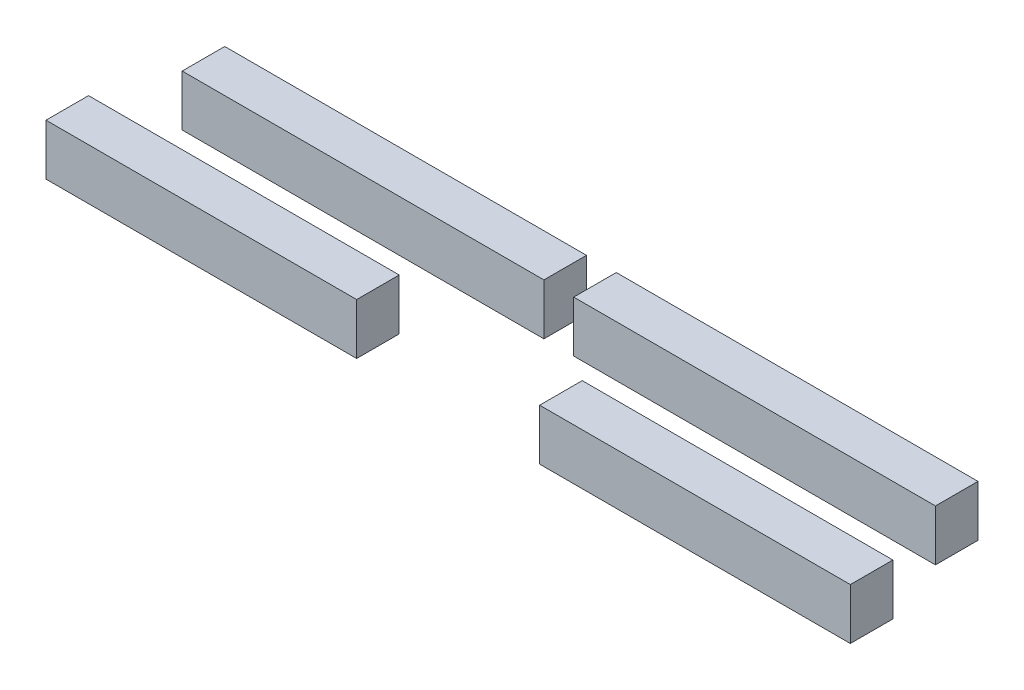
ISO-10303-21;
HEADER;
FILE_DESCRIPTION(('STEP AP214'),'2;1');
FILE_NAME('part.step','',(''),(''),'','','');
FILE_SCHEMA(('AUTOMOTIVE_DESIGN { 1 0 10303 214 1 1 1 1 }'));
ENDSEC;
DATA;
#1=APPLICATION_CONTEXT('core data for automotive mechanical design processes');
#2=APPLICATION_PROTOCOL_DEFINITION('international standard','automotive_design',2000,#1);
#3=PRODUCT_CONTEXT('',#1,'mechanical');
#4=PRODUCT('Part','Part','',(#3));
#5=PRODUCT_RELATED_PRODUCT_CATEGORY('part','',(#4));
#6=PRODUCT_DEFINITION_FORMATION('','',#4);
#7=PRODUCT_DEFINITION_CONTEXT('part definition',#1,'design');
#8=PRODUCT_DEFINITION('design','',#6,#7);
#9=PRODUCT_DEFINITION_SHAPE('','',#8);
#10=(LENGTH_UNIT() NAMED_UNIT(*) SI_UNIT(.MILLI.,.METRE.));
#11=(NAMED_UNIT(*) PLANE_ANGLE_UNIT() SI_UNIT($,.RADIAN.));
#12=(NAMED_UNIT(*) SI_UNIT($,.STERADIAN.) SOLID_ANGLE_UNIT());
#13=UNCERTAINTY_MEASURE_WITH_UNIT(LENGTH_MEASURE(1.E-05),#10,'distance_accuracy_value','');
#14=(GEOMETRIC_REPRESENTATION_CONTEXT(3) GLOBAL_UNCERTAINTY_ASSIGNED_CONTEXT((#13)) GLOBAL_UNIT_ASSIGNED_CONTEXT((#10,
#11,#12)) REPRESENTATION_CONTEXT('',''));
#15=CARTESIAN_POINT('',(0.,0.,0.));
#16=DIRECTION('',(0.,0.,1.));
#17=DIRECTION('',(1.,0.,0.));
#18=AXIS2_PLACEMENT_3D('',#15,#16,#17);
#19=CARTESIAN_POINT('',(51.75,6.,-22.5));
#20=DIRECTION('',(1.,0.,0.));
#21=DIRECTION('',(0.,0.,-1.));
#22=AXIS2_PLACEMENT_3D('',#19,#20,#21);
#23=PLANE('',#22);
#24=DIRECTION('',(0.,0.,1.));
#25=VECTOR('',#24,1.);
#26=CARTESIAN_POINT('',(51.75,0.,-22.5));
#27=LINE('',#26,#25);
#28=CARTESIAN_POINT('',(51.75,0.,-22.5));
#29=VERTEX_POINT('',#28);
#30=CARTESIAN_POINT('',(51.75,0.,-17.5));
#31=VERTEX_POINT('',#30);
#32=EDGE_CURVE('E106',#29,#31,#27,.T.);
#33=ORIENTED_EDGE('',*,*,#32,.T.);
#34=DIRECTION('',(0.,-1.,0.));
#35=VECTOR('',#34,1.);
#36=CARTESIAN_POINT('',(51.75,6.,-17.5));
#37=LINE('',#36,#35);
#38=CARTESIAN_POINT('',(51.75,6.,-17.5));
#39=VERTEX_POINT('',#38);
#40=EDGE_CURVE('E12',#39,#31,#37,.T.);
#41=ORIENTED_EDGE('',*,*,#40,.F.);
#42=DIRECTION('',(0.,0.,1.));
#43=VECTOR('',#42,1.);
#44=CARTESIAN_POINT('',(51.75,6.,-22.5));
#45=LINE('',#44,#43);
#46=CARTESIAN_POINT('',(51.75,6.,-22.5));
#47=VERTEX_POINT('',#46);
#48=EDGE_CURVE('E94',#47,#39,#45,.T.);
#49=ORIENTED_EDGE('',*,*,#48,.F.);
#50=DIRECTION('',(0.,-1.,0.));
#51=VECTOR('',#50,1.);
#52=CARTESIAN_POINT('',(51.75,6.,-22.5));
#53=LINE('',#52,#51);
#54=EDGE_CURVE('E102',#47,#29,#53,.T.);
#55=ORIENTED_EDGE('',*,*,#54,.T.);
#56=EDGE_LOOP('',(#33,#41,#49,#55));
#57=FACE_BOUND('',#56,.T.);
#58=ADVANCED_FACE('F43',(#57),#23,.F.);
#59=CARTESIAN_POINT('',(51.75,6.,-17.5));
#60=DIRECTION('',(0.,0.,-1.));
#61=DIRECTION('',(-1.,0.,0.));
#62=AXIS2_PLACEMENT_3D('',#59,#60,#61);
#63=PLANE('',#62);
#64=DIRECTION('',(1.,0.,0.));
#65=VECTOR('',#64,1.);
#66=CARTESIAN_POINT('',(51.75,0.,-17.5));
#67=LINE('',#66,#65);
#68=CARTESIAN_POINT('',(94.25,0.,-17.5));
#69=VERTEX_POINT('',#68);
#70=EDGE_CURVE('E98',#31,#69,#67,.T.);
#71=ORIENTED_EDGE('',*,*,#70,.T.);
#72=DIRECTION('',(0.,-1.,0.));
#73=VECTOR('',#72,1.);
#74=CARTESIAN_POINT('',(94.25,6.,-17.5));
#75=LINE('',#74,#73);
#76=CARTESIAN_POINT('',(94.25,6.,-17.5));
#77=VERTEX_POINT('',#76);
#78=EDGE_CURVE('E51',#77,#69,#75,.T.);
#79=ORIENTED_EDGE('',*,*,#78,.F.);
#80=DIRECTION('',(1.,0.,0.));
#81=VECTOR('',#80,1.);
#82=CARTESIAN_POINT('',(51.75,6.,-17.5));
#83=LINE('',#82,#81);
#84=EDGE_CURVE('E89',#39,#77,#83,.T.);
#85=ORIENTED_EDGE('',*,*,#84,.F.);
#86=ORIENTED_EDGE('',*,*,#40,.T.);
#87=EDGE_LOOP('',(#71,#79,#85,#86));
#88=FACE_BOUND('',#87,.T.);
#89=ADVANCED_FACE('F97',(#88),#63,.F.);
#90=CARTESIAN_POINT('',(94.25,6.,-22.5));
#91=DIRECTION('',(-1.,0.,0.));
#92=DIRECTION('',(0.,0.,1.));
#93=AXIS2_PLACEMENT_3D('',#90,#91,#92);
#94=PLANE('',#93);
#95=DIRECTION('',(0.,0.,-1.));
#96=VECTOR('',#95,1.);
#97=CARTESIAN_POINT('',(94.25,0.,-22.5));
#98=LINE('',#97,#96);
#99=CARTESIAN_POINT('',(94.25,0.,-22.5));
#100=VERTEX_POINT('',#99);
#101=EDGE_CURVE('E76',#69,#100,#98,.T.);
#102=ORIENTED_EDGE('',*,*,#101,.T.);
#103=DIRECTION('',(0.,-1.,0.));
#104=VECTOR('',#103,1.);
#105=CARTESIAN_POINT('',(94.25,6.,-22.5));
#106=LINE('',#105,#104);
#107=CARTESIAN_POINT('',(94.25,6.,-22.5));
#108=VERTEX_POINT('',#107);
#109=EDGE_CURVE('E99',#108,#100,#106,.T.);
#110=ORIENTED_EDGE('',*,*,#109,.F.);
#111=DIRECTION('',(0.,0.,-1.));
#112=VECTOR('',#111,1.);
#113=CARTESIAN_POINT('',(94.25,6.,-22.5));
#114=LINE('',#113,#112);
#115=EDGE_CURVE('E92',#77,#108,#114,.T.);
#116=ORIENTED_EDGE('',*,*,#115,.F.);
#117=ORIENTED_EDGE('',*,*,#78,.T.);
#118=EDGE_LOOP('',(#102,#110,#116,#117));
#119=FACE_BOUND('',#118,.T.);
#120=ADVANCED_FACE('F100',(#119),#94,.F.);
#121=CARTESIAN_POINT('',(51.75,6.,-22.5));
#122=DIRECTION('',(0.,0.,1.));
#123=DIRECTION('',(1.,0.,0.));
#124=AXIS2_PLACEMENT_3D('',#121,#122,#123);
#125=PLANE('',#124);
#126=DIRECTION('',(-1.,0.,0.));
#127=VECTOR('',#126,1.);
#128=CARTESIAN_POINT('',(51.75,0.,-22.5));
#129=LINE('',#128,#127);
#130=EDGE_CURVE('E82',#100,#29,#129,.T.);
#131=ORIENTED_EDGE('',*,*,#130,.T.);
#132=ORIENTED_EDGE('',*,*,#54,.F.);
#133=DIRECTION('',(-1.,0.,0.));
#134=VECTOR('',#133,1.);
#135=CARTESIAN_POINT('',(51.75,6.,-22.5));
#136=LINE('',#135,#134);
#137=EDGE_CURVE('E59',#108,#47,#136,.T.);
#138=ORIENTED_EDGE('',*,*,#137,.F.);
#139=ORIENTED_EDGE('',*,*,#109,.T.);
#140=EDGE_LOOP('',(#131,#132,#138,#139));
#141=FACE_BOUND('',#140,.T.);
#142=ADVANCED_FACE('F113',(#141),#125,.F.);
#143=CARTESIAN_POINT('',(51.75,6.,-17.5));
#144=DIRECTION('',(0.,1.,0.));
#145=DIRECTION('',(0.,0.,1.));
#146=AXIS2_PLACEMENT_3D('',#143,#144,#145);
#147=PLANE('',#146);
#148=ORIENTED_EDGE('',*,*,#48,.T.);
#149=ORIENTED_EDGE('',*,*,#84,.T.);
#150=ORIENTED_EDGE('',*,*,#115,.T.);
#151=ORIENTED_EDGE('',*,*,#137,.T.);
#152=EDGE_LOOP('',(#148,#149,#150,#151));
#153=FACE_BOUND('',#152,.T.);
#154=ADVANCED_FACE('F90',(#153),#147,.T.);
#155=CARTESIAN_POINT('',(51.75,0.,-17.5));
#156=DIRECTION('',(0.,1.,0.));
#157=DIRECTION('',(0.,0.,1.));
#158=AXIS2_PLACEMENT_3D('',#155,#156,#157);
#159=PLANE('',#158);
#160=ORIENTED_EDGE('',*,*,#32,.F.);
#161=ORIENTED_EDGE('',*,*,#130,.F.);
#162=ORIENTED_EDGE('',*,*,#101,.F.);
#163=ORIENTED_EDGE('',*,*,#70,.F.);
#164=EDGE_LOOP('',(#160,#161,#162,#163));
#165=FACE_BOUND('',#164,.T.);
#166=ADVANCED_FACE('F116',(#165),#159,.F.);
#167=CLOSED_SHELL('',(#58,#89,#120,#142,#154,#166));
#168=MANIFOLD_SOLID_BREP('B2',#167);
#169=CARTESIAN_POINT('',(5.75,6.,-22.5));
#170=DIRECTION('',(1.,0.,0.));
#171=DIRECTION('',(0.,0.,-1.));
#172=AXIS2_PLACEMENT_3D('',#169,#170,#171);
#173=PLANE('',#172);
#174=DIRECTION('',(0.,0.,1.));
#175=VECTOR('',#174,1.);
#176=CARTESIAN_POINT('',(5.75,0.,-22.5));
#177=LINE('',#176,#175);
#178=CARTESIAN_POINT('',(5.75,0.,-22.5));
#179=VERTEX_POINT('',#178);
#180=CARTESIAN_POINT('',(5.75,0.,-17.5));
#181=VERTEX_POINT('',#180);
#182=EDGE_CURVE('E239',#179,#181,#177,.T.);
#183=ORIENTED_EDGE('',*,*,#182,.T.);
#184=DIRECTION('',(0.,-1.,0.));
#185=VECTOR('',#184,1.);
#186=CARTESIAN_POINT('',(5.75,6.,-17.5));
#187=LINE('',#186,#185);
#188=CARTESIAN_POINT('',(5.75,6.,-17.5));
#189=VERTEX_POINT('',#188);
#190=EDGE_CURVE('E41',#189,#181,#187,.T.);
#191=ORIENTED_EDGE('',*,*,#190,.F.);
#192=DIRECTION('',(0.,0.,1.));
#193=VECTOR('',#192,1.);
#194=CARTESIAN_POINT('',(5.75,6.,-22.5));
#195=LINE('',#194,#193);
#196=CARTESIAN_POINT('',(5.75,6.,-22.5));
#197=VERTEX_POINT('',#196);
#198=EDGE_CURVE('E227',#197,#189,#195,.T.);
#199=ORIENTED_EDGE('',*,*,#198,.F.);
#200=DIRECTION('',(0.,-1.,0.));
#201=VECTOR('',#200,1.);
#202=CARTESIAN_POINT('',(5.75,6.,-22.5));
#203=LINE('',#202,#201);
#204=EDGE_CURVE('E235',#197,#179,#203,.T.);
#205=ORIENTED_EDGE('',*,*,#204,.T.);
#206=EDGE_LOOP('',(#183,#191,#199,#205));
#207=FACE_BOUND('',#206,.T.);
#208=ADVANCED_FACE('F176',(#207),#173,.F.);
#209=CARTESIAN_POINT('',(5.75,6.,-17.5));
#210=DIRECTION('',(0.,0.,-1.));
#211=DIRECTION('',(-1.,0.,0.));
#212=AXIS2_PLACEMENT_3D('',#209,#210,#211);
#213=PLANE('',#212);
#214=DIRECTION('',(1.,0.,0.));
#215=VECTOR('',#214,1.);
#216=CARTESIAN_POINT('',(5.75,0.,-17.5));
#217=LINE('',#216,#215);
#218=CARTESIAN_POINT('',(48.25,0.,-17.5));
#219=VERTEX_POINT('',#218);
#220=EDGE_CURVE('E231',#181,#219,#217,.T.);
#221=ORIENTED_EDGE('',*,*,#220,.T.);
#222=DIRECTION('',(0.,-1.,0.));
#223=VECTOR('',#222,1.);
#224=CARTESIAN_POINT('',(48.25,6.,-17.5));
#225=LINE('',#224,#223);
#226=CARTESIAN_POINT('',(48.25,6.,-17.5));
#227=VERTEX_POINT('',#226);
#228=EDGE_CURVE('E184',#227,#219,#225,.T.);
#229=ORIENTED_EDGE('',*,*,#228,.F.);
#230=DIRECTION('',(1.,0.,0.));
#231=VECTOR('',#230,1.);
#232=CARTESIAN_POINT('',(5.75,6.,-17.5));
#233=LINE('',#232,#231);
#234=EDGE_CURVE('E222',#189,#227,#233,.T.);
#235=ORIENTED_EDGE('',*,*,#234,.F.);
#236=ORIENTED_EDGE('',*,*,#190,.T.);
#237=EDGE_LOOP('',(#221,#229,#235,#236));
#238=FACE_BOUND('',#237,.T.);
#239=ADVANCED_FACE('F230',(#238),#213,.F.);
#240=CARTESIAN_POINT('',(48.25,6.,-22.5));
#241=DIRECTION('',(-1.,0.,0.));
#242=DIRECTION('',(0.,0.,1.));
#243=AXIS2_PLACEMENT_3D('',#240,#241,#242);
#244=PLANE('',#243);
#245=DIRECTION('',(0.,0.,-1.));
#246=VECTOR('',#245,1.);
#247=CARTESIAN_POINT('',(48.25,0.,-22.5));
#248=LINE('',#247,#246);
#249=CARTESIAN_POINT('',(48.25,0.,-22.5));
#250=VERTEX_POINT('',#249);
#251=EDGE_CURVE('E209',#219,#250,#248,.T.);
#252=ORIENTED_EDGE('',*,*,#251,.T.);
#253=DIRECTION('',(0.,-1.,0.));
#254=VECTOR('',#253,1.);
#255=CARTESIAN_POINT('',(48.25,6.,-22.5));
#256=LINE('',#255,#254);
#257=CARTESIAN_POINT('',(48.25,6.,-22.5));
#258=VERTEX_POINT('',#257);
#259=EDGE_CURVE('E232',#258,#250,#256,.T.);
#260=ORIENTED_EDGE('',*,*,#259,.F.);
#261=DIRECTION('',(0.,0.,-1.));
#262=VECTOR('',#261,1.);
#263=CARTESIAN_POINT('',(48.25,6.,-22.5));
#264=LINE('',#263,#262);
#265=EDGE_CURVE('E225',#227,#258,#264,.T.);
#266=ORIENTED_EDGE('',*,*,#265,.F.);
#267=ORIENTED_EDGE('',*,*,#228,.T.);
#268=EDGE_LOOP('',(#252,#260,#266,#267));
#269=FACE_BOUND('',#268,.T.);
#270=ADVANCED_FACE('F233',(#269),#244,.F.);
#271=CARTESIAN_POINT('',(5.75,6.,-22.5));
#272=DIRECTION('',(0.,0.,1.));
#273=DIRECTION('',(1.,0.,0.));
#274=AXIS2_PLACEMENT_3D('',#271,#272,#273);
#275=PLANE('',#274);
#276=DIRECTION('',(-1.,0.,0.));
#277=VECTOR('',#276,1.);
#278=CARTESIAN_POINT('',(5.75,0.,-22.5));
#279=LINE('',#278,#277);
#280=EDGE_CURVE('E215',#250,#179,#279,.T.);
#281=ORIENTED_EDGE('',*,*,#280,.T.);
#282=ORIENTED_EDGE('',*,*,#204,.F.);
#283=DIRECTION('',(-1.,0.,0.));
#284=VECTOR('',#283,1.);
#285=CARTESIAN_POINT('',(5.75,6.,-22.5));
#286=LINE('',#285,#284);
#287=EDGE_CURVE('E192',#258,#197,#286,.T.);
#288=ORIENTED_EDGE('',*,*,#287,.F.);
#289=ORIENTED_EDGE('',*,*,#259,.T.);
#290=EDGE_LOOP('',(#281,#282,#288,#289));
#291=FACE_BOUND('',#290,.T.);
#292=ADVANCED_FACE('F246',(#291),#275,.F.);
#293=CARTESIAN_POINT('',(5.75,6.,-17.5));
#294=DIRECTION('',(0.,1.,0.));
#295=DIRECTION('',(0.,0.,1.));
#296=AXIS2_PLACEMENT_3D('',#293,#294,#295);
#297=PLANE('',#296);
#298=ORIENTED_EDGE('',*,*,#198,.T.);
#299=ORIENTED_EDGE('',*,*,#234,.T.);
#300=ORIENTED_EDGE('',*,*,#265,.T.);
#301=ORIENTED_EDGE('',*,*,#287,.T.);
#302=EDGE_LOOP('',(#298,#299,#300,#301));
#303=FACE_BOUND('',#302,.T.);
#304=ADVANCED_FACE('F223',(#303),#297,.T.);
#305=CARTESIAN_POINT('',(5.75,0.,-17.5));
#306=DIRECTION('',(0.,1.,0.));
#307=DIRECTION('',(0.,0.,1.));
#308=AXIS2_PLACEMENT_3D('',#305,#306,#307);
#309=PLANE('',#308);
#310=ORIENTED_EDGE('',*,*,#182,.F.);
#311=ORIENTED_EDGE('',*,*,#280,.F.);
#312=ORIENTED_EDGE('',*,*,#251,.F.);
#313=ORIENTED_EDGE('',*,*,#220,.F.);
#314=EDGE_LOOP('',(#310,#311,#312,#313));
#315=FACE_BOUND('',#314,.T.);
#316=ADVANCED_FACE('F249',(#315),#309,.F.);
#317=CLOSED_SHELL('',(#208,#239,#270,#292,#304,#316));
#318=MANIFOLD_SOLID_BREP('B6',#317);
#319=CARTESIAN_POINT('',(60.75,6.,-9.5));
#320=DIRECTION('',(1.,0.,0.));
#321=DIRECTION('',(0.,0.,-1.));
#322=AXIS2_PLACEMENT_3D('',#319,#320,#321);
#323=PLANE('',#322);
#324=DIRECTION('',(0.,0.,1.));
#325=VECTOR('',#324,1.);
#326=CARTESIAN_POINT('',(60.75,0.,-9.5));
#327=LINE('',#326,#325);
#328=CARTESIAN_POINT('',(60.75,0.,-9.5));
#329=VERTEX_POINT('',#328);
#330=CARTESIAN_POINT('',(60.75,0.,-4.5));
#331=VERTEX_POINT('',#330);
#332=EDGE_CURVE('E371',#329,#331,#327,.T.);
#333=ORIENTED_EDGE('',*,*,#332,.T.);
#334=DIRECTION('',(0.,-1.,0.));
#335=VECTOR('',#334,1.);
#336=CARTESIAN_POINT('',(60.75,6.,-4.5));
#337=LINE('',#336,#335);
#338=CARTESIAN_POINT('',(60.75,6.,-4.5));
#339=VERTEX_POINT('',#338);
#340=EDGE_CURVE('E174',#339,#331,#337,.T.);
#341=ORIENTED_EDGE('',*,*,#340,.F.);
#342=DIRECTION('',(0.,0.,1.));
#343=VECTOR('',#342,1.);
#344=CARTESIAN_POINT('',(60.75,6.,-9.5));
#345=LINE('',#344,#343);
#346=CARTESIAN_POINT('',(60.75,6.,-9.5));
#347=VERTEX_POINT('',#346);
#348=EDGE_CURVE('E359',#347,#339,#345,.T.);
#349=ORIENTED_EDGE('',*,*,#348,.F.);
#350=DIRECTION('',(0.,-1.,0.));
#351=VECTOR('',#350,1.);
#352=CARTESIAN_POINT('',(60.75,6.,-9.5));
#353=LINE('',#352,#351);
#354=EDGE_CURVE('E367',#347,#329,#353,.T.);
#355=ORIENTED_EDGE('',*,*,#354,.T.);
#356=EDGE_LOOP('',(#333,#341,#349,#355));
#357=FACE_BOUND('',#356,.T.);
#358=ADVANCED_FACE('F308',(#357),#323,.F.);
#359=CARTESIAN_POINT('',(60.75,6.,-4.5));
#360=DIRECTION('',(0.,0.,-1.));
#361=DIRECTION('',(-1.,0.,0.));
#362=AXIS2_PLACEMENT_3D('',#359,#360,#361);
#363=PLANE('',#362);
#364=DIRECTION('',(1.,0.,0.));
#365=VECTOR('',#364,1.);
#366=CARTESIAN_POINT('',(60.75,0.,-4.5));
#367=LINE('',#366,#365);
#368=CARTESIAN_POINT('',(97.25,0.,-4.5));
#369=VERTEX_POINT('',#368);
#370=EDGE_CURVE('E363',#331,#369,#367,.T.);
#371=ORIENTED_EDGE('',*,*,#370,.T.);
#372=DIRECTION('',(0.,-1.,0.));
#373=VECTOR('',#372,1.);
#374=CARTESIAN_POINT('',(97.25,6.,-4.5));
#375=LINE('',#374,#373);
#376=CARTESIAN_POINT('',(97.25,6.,-4.5));
#377=VERTEX_POINT('',#376);
#378=EDGE_CURVE('E316',#377,#369,#375,.T.);
#379=ORIENTED_EDGE('',*,*,#378,.F.);
#380=DIRECTION('',(1.,0.,0.));
#381=VECTOR('',#380,1.);
#382=CARTESIAN_POINT('',(60.75,6.,-4.5));
#383=LINE('',#382,#381);
#384=EDGE_CURVE('E354',#339,#377,#383,.T.);
#385=ORIENTED_EDGE('',*,*,#384,.F.);
#386=ORIENTED_EDGE('',*,*,#340,.T.);
#387=EDGE_LOOP('',(#371,#379,#385,#386));
#388=FACE_BOUND('',#387,.T.);
#389=ADVANCED_FACE('F362',(#388),#363,.F.);
#390=CARTESIAN_POINT('',(97.25,6.,-9.5));
#391=DIRECTION('',(-1.,0.,0.));
#392=DIRECTION('',(0.,0.,1.));
#393=AXIS2_PLACEMENT_3D('',#390,#391,#392);
#394=PLANE('',#393);
#395=DIRECTION('',(0.,0.,-1.));
#396=VECTOR('',#395,1.);
#397=CARTESIAN_POINT('',(97.25,0.,-9.5));
#398=LINE('',#397,#396);
#399=CARTESIAN_POINT('',(97.25,0.,-9.5));
#400=VERTEX_POINT('',#399);
#401=EDGE_CURVE('E341',#369,#400,#398,.T.);
#402=ORIENTED_EDGE('',*,*,#401,.T.);
#403=DIRECTION('',(0.,-1.,0.));
#404=VECTOR('',#403,1.);
#405=CARTESIAN_POINT('',(97.25,6.,-9.5));
#406=LINE('',#405,#404);
#407=CARTESIAN_POINT('',(97.25,6.,-9.5));
#408=VERTEX_POINT('',#407);
#409=EDGE_CURVE('E364',#408,#400,#406,.T.);
#410=ORIENTED_EDGE('',*,*,#409,.F.);
#411=DIRECTION('',(0.,0.,-1.));
#412=VECTOR('',#411,1.);
#413=CARTESIAN_POINT('',(97.25,6.,-9.5));
#414=LINE('',#413,#412);
#415=EDGE_CURVE('E357',#377,#408,#414,.T.);
#416=ORIENTED_EDGE('',*,*,#415,.F.);
#417=ORIENTED_EDGE('',*,*,#378,.T.);
#418=EDGE_LOOP('',(#402,#410,#416,#417));
#419=FACE_BOUND('',#418,.T.);
#420=ADVANCED_FACE('F365',(#419),#394,.F.);
#421=CARTESIAN_POINT('',(60.75,6.,-9.5));
#422=DIRECTION('',(0.,0.,1.));
#423=DIRECTION('',(1.,0.,0.));
#424=AXIS2_PLACEMENT_3D('',#421,#422,#423);
#425=PLANE('',#424);
#426=DIRECTION('',(-1.,0.,0.));
#427=VECTOR('',#426,1.);
#428=CARTESIAN_POINT('',(60.75,0.,-9.5));
#429=LINE('',#428,#427);
#430=EDGE_CURVE('E347',#400,#329,#429,.T.);
#431=ORIENTED_EDGE('',*,*,#430,.T.);
#432=ORIENTED_EDGE('',*,*,#354,.F.);
#433=DIRECTION('',(-1.,0.,0.));
#434=VECTOR('',#433,1.);
#435=CARTESIAN_POINT('',(60.75,6.,-9.5));
#436=LINE('',#435,#434);
#437=EDGE_CURVE('E324',#408,#347,#436,.T.);
#438=ORIENTED_EDGE('',*,*,#437,.F.);
#439=ORIENTED_EDGE('',*,*,#409,.T.);
#440=EDGE_LOOP('',(#431,#432,#438,#439));
#441=FACE_BOUND('',#440,.T.);
#442=ADVANCED_FACE('F378',(#441),#425,.F.);
#443=CARTESIAN_POINT('',(60.75,6.,-4.5));
#444=DIRECTION('',(0.,1.,0.));
#445=DIRECTION('',(0.,0.,1.));
#446=AXIS2_PLACEMENT_3D('',#443,#444,#445);
#447=PLANE('',#446);
#448=ORIENTED_EDGE('',*,*,#348,.T.);
#449=ORIENTED_EDGE('',*,*,#384,.T.);
#450=ORIENTED_EDGE('',*,*,#415,.T.);
#451=ORIENTED_EDGE('',*,*,#437,.T.);
#452=EDGE_LOOP('',(#448,#449,#450,#451));
#453=FACE_BOUND('',#452,.T.);
#454=ADVANCED_FACE('F355',(#453),#447,.T.);
#455=CARTESIAN_POINT('',(60.75,0.,-4.5));
#456=DIRECTION('',(0.,1.,0.));
#457=DIRECTION('',(0.,0.,1.));
#458=AXIS2_PLACEMENT_3D('',#455,#456,#457);
#459=PLANE('',#458);
#460=ORIENTED_EDGE('',*,*,#332,.F.);
#461=ORIENTED_EDGE('',*,*,#430,.F.);
#462=ORIENTED_EDGE('',*,*,#401,.F.);
#463=ORIENTED_EDGE('',*,*,#370,.F.);
#464=EDGE_LOOP('',(#460,#461,#462,#463));
#465=FACE_BOUND('',#464,.T.);
#466=ADVANCED_FACE('F381',(#465),#459,.F.);
#467=CLOSED_SHELL('',(#358,#389,#420,#442,#454,#466));
#468=MANIFOLD_SOLID_BREP('B35',#467);
#469=CARTESIAN_POINT('',(2.75,6.,-9.5));
#470=DIRECTION('',(1.,0.,0.));
#471=DIRECTION('',(0.,0.,-1.));
#472=AXIS2_PLACEMENT_3D('',#469,#470,#471);
#473=PLANE('',#472);
#474=DIRECTION('',(0.,0.,1.));
#475=VECTOR('',#474,1.);
#476=CARTESIAN_POINT('',(2.75,0.,-9.5));
#477=LINE('',#476,#475);
#478=CARTESIAN_POINT('',(2.75,0.,-9.5));
#479=VERTEX_POINT('',#478);
#480=CARTESIAN_POINT('',(2.75,0.,-4.5));
#481=VERTEX_POINT('',#480);
#482=EDGE_CURVE('E494',#479,#481,#477,.T.);
#483=ORIENTED_EDGE('',*,*,#482,.T.);
#484=DIRECTION('',(0.,-1.,0.));
#485=VECTOR('',#484,1.);
#486=CARTESIAN_POINT('',(2.75,6.,-4.5));
#487=LINE('',#486,#485);
#488=CARTESIAN_POINT('',(2.75,6.,-4.5));
#489=VERTEX_POINT('',#488);
#490=EDGE_CURVE('E306',#489,#481,#487,.T.);
#491=ORIENTED_EDGE('',*,*,#490,.F.);
#492=DIRECTION('',(0.,0.,1.));
#493=VECTOR('',#492,1.);
#494=CARTESIAN_POINT('',(2.75,6.,-9.5));
#495=LINE('',#494,#493);
#496=CARTESIAN_POINT('',(2.75,6.,-9.5));
#497=VERTEX_POINT('',#496);
#498=EDGE_CURVE('E482',#497,#489,#495,.T.);
#499=ORIENTED_EDGE('',*,*,#498,.F.);
#500=DIRECTION('',(0.,-1.,0.));
#501=VECTOR('',#500,1.);
#502=CARTESIAN_POINT('',(2.75,6.,-9.5));
#503=LINE('',#502,#501);
#504=EDGE_CURVE('E490',#497,#479,#503,.T.);
#505=ORIENTED_EDGE('',*,*,#504,.T.);
#506=EDGE_LOOP('',(#483,#491,#499,#505));
#507=FACE_BOUND('',#506,.T.);
#508=ADVANCED_FACE('F431',(#507),#473,.F.);
#509=CARTESIAN_POINT('',(2.75,6.,-4.5));
#510=DIRECTION('',(0.,0.,-1.));
#511=DIRECTION('',(-1.,0.,0.));
#512=AXIS2_PLACEMENT_3D('',#509,#510,#511);
#513=PLANE('',#512);
#514=DIRECTION('',(1.,0.,0.));
#515=VECTOR('',#514,1.);
#516=CARTESIAN_POINT('',(2.75,0.,-4.5));
#517=LINE('',#516,#515);
#518=CARTESIAN_POINT('',(39.25,0.,-4.5));
#519=VERTEX_POINT('',#518);
#520=EDGE_CURVE('E486',#481,#519,#517,.T.);
#521=ORIENTED_EDGE('',*,*,#520,.T.);
#522=DIRECTION('',(0.,-1.,0.));
#523=VECTOR('',#522,1.);
#524=CARTESIAN_POINT('',(39.25,6.,-4.5));
#525=LINE('',#524,#523);
#526=CARTESIAN_POINT('',(39.25,6.,-4.5));
#527=VERTEX_POINT('',#526);
#528=EDGE_CURVE('E439',#527,#519,#525,.T.);
#529=ORIENTED_EDGE('',*,*,#528,.F.);
#530=DIRECTION('',(1.,0.,0.));
#531=VECTOR('',#530,1.);
#532=CARTESIAN_POINT('',(2.75,6.,-4.5));
#533=LINE('',#532,#531);
#534=EDGE_CURVE('E477',#489,#527,#533,.T.);
#535=ORIENTED_EDGE('',*,*,#534,.F.);
#536=ORIENTED_EDGE('',*,*,#490,.T.);
#537=EDGE_LOOP('',(#521,#529,#535,#536));
#538=FACE_BOUND('',#537,.T.);
#539=ADVANCED_FACE('F485',(#538),#513,.F.);
#540=CARTESIAN_POINT('',(39.25,6.,-9.5));
#541=DIRECTION('',(-1.,0.,0.));
#542=DIRECTION('',(0.,0.,1.));
#543=AXIS2_PLACEMENT_3D('',#540,#541,#542);
#544=PLANE('',#543);
#545=DIRECTION('',(0.,0.,-1.));
#546=VECTOR('',#545,1.);
#547=CARTESIAN_POINT('',(39.25,0.,-9.5));
#548=LINE('',#547,#546);
#549=CARTESIAN_POINT('',(39.25,0.,-9.5));
#550=VERTEX_POINT('',#549);
#551=EDGE_CURVE('E464',#519,#550,#548,.T.);
#552=ORIENTED_EDGE('',*,*,#551,.T.);
#553=DIRECTION('',(0.,-1.,0.));
#554=VECTOR('',#553,1.);
#555=CARTESIAN_POINT('',(39.25,6.,-9.5));
#556=LINE('',#555,#554);
#557=CARTESIAN_POINT('',(39.25,6.,-9.5));
#558=VERTEX_POINT('',#557);
#559=EDGE_CURVE('E487',#558,#550,#556,.T.);
#560=ORIENTED_EDGE('',*,*,#559,.F.);
#561=DIRECTION('',(0.,0.,-1.));
#562=VECTOR('',#561,1.);
#563=CARTESIAN_POINT('',(39.25,6.,-9.5));
#564=LINE('',#563,#562);
#565=EDGE_CURVE('E480',#527,#558,#564,.T.);
#566=ORIENTED_EDGE('',*,*,#565,.F.);
#567=ORIENTED_EDGE('',*,*,#528,.T.);
#568=EDGE_LOOP('',(#552,#560,#566,#567));
#569=FACE_BOUND('',#568,.T.);
#570=ADVANCED_FACE('F488',(#569),#544,.F.);
#571=CARTESIAN_POINT('',(2.75,6.,-9.5));
#572=DIRECTION('',(0.,0.,1.));
#573=DIRECTION('',(1.,0.,0.));
#574=AXIS2_PLACEMENT_3D('',#571,#572,#573);
#575=PLANE('',#574);
#576=DIRECTION('',(-1.,0.,0.));
#577=VECTOR('',#576,1.);
#578=CARTESIAN_POINT('',(2.75,0.,-9.5));
#579=LINE('',#578,#577);
#580=EDGE_CURVE('E470',#550,#479,#579,.T.);
#581=ORIENTED_EDGE('',*,*,#580,.T.);
#582=ORIENTED_EDGE('',*,*,#504,.F.);
#583=DIRECTION('',(-1.,0.,0.));
#584=VECTOR('',#583,1.);
#585=CARTESIAN_POINT('',(2.75,6.,-9.5));
#586=LINE('',#585,#584);
#587=EDGE_CURVE('E447',#558,#497,#586,.T.);
#588=ORIENTED_EDGE('',*,*,#587,.F.);
#589=ORIENTED_EDGE('',*,*,#559,.T.);
#590=EDGE_LOOP('',(#581,#582,#588,#589));
#591=FACE_BOUND('',#590,.T.);
#592=ADVANCED_FACE('F501',(#591),#575,.F.);
#593=CARTESIAN_POINT('',(2.75,6.,-4.5));
#594=DIRECTION('',(0.,1.,0.));
#595=DIRECTION('',(0.,0.,1.));
#596=AXIS2_PLACEMENT_3D('',#593,#594,#595);
#597=PLANE('',#596);
#598=ORIENTED_EDGE('',*,*,#498,.T.);
#599=ORIENTED_EDGE('',*,*,#534,.T.);
#600=ORIENTED_EDGE('',*,*,#565,.T.);
#601=ORIENTED_EDGE('',*,*,#587,.T.);
#602=EDGE_LOOP('',(#598,#599,#600,#601));
#603=FACE_BOUND('',#602,.T.);
#604=ADVANCED_FACE('F478',(#603),#597,.T.);
#605=CARTESIAN_POINT('',(2.75,0.,-4.5));
#606=DIRECTION('',(0.,1.,0.));
#607=DIRECTION('',(0.,0.,1.));
#608=AXIS2_PLACEMENT_3D('',#605,#606,#607);
#609=PLANE('',#608);
#610=ORIENTED_EDGE('',*,*,#482,.F.);
#611=ORIENTED_EDGE('',*,*,#580,.F.);
#612=ORIENTED_EDGE('',*,*,#551,.F.);
#613=ORIENTED_EDGE('',*,*,#520,.F.);
#614=EDGE_LOOP('',(#610,#611,#612,#613));
#615=FACE_BOUND('',#614,.T.);
#616=ADVANCED_FACE('F504',(#615),#609,.F.);
#617=CLOSED_SHELL('',(#508,#539,#570,#592,#604,#616));
#618=MANIFOLD_SOLID_BREP('B168',#617);
#619=ADVANCED_BREP_SHAPE_REPRESENTATION('',(#18,#168,#318,#468,#618),#14);
#620=SHAPE_DEFINITION_REPRESENTATION(#9,#619);
ENDSEC;
END-ISO-10303-21;
